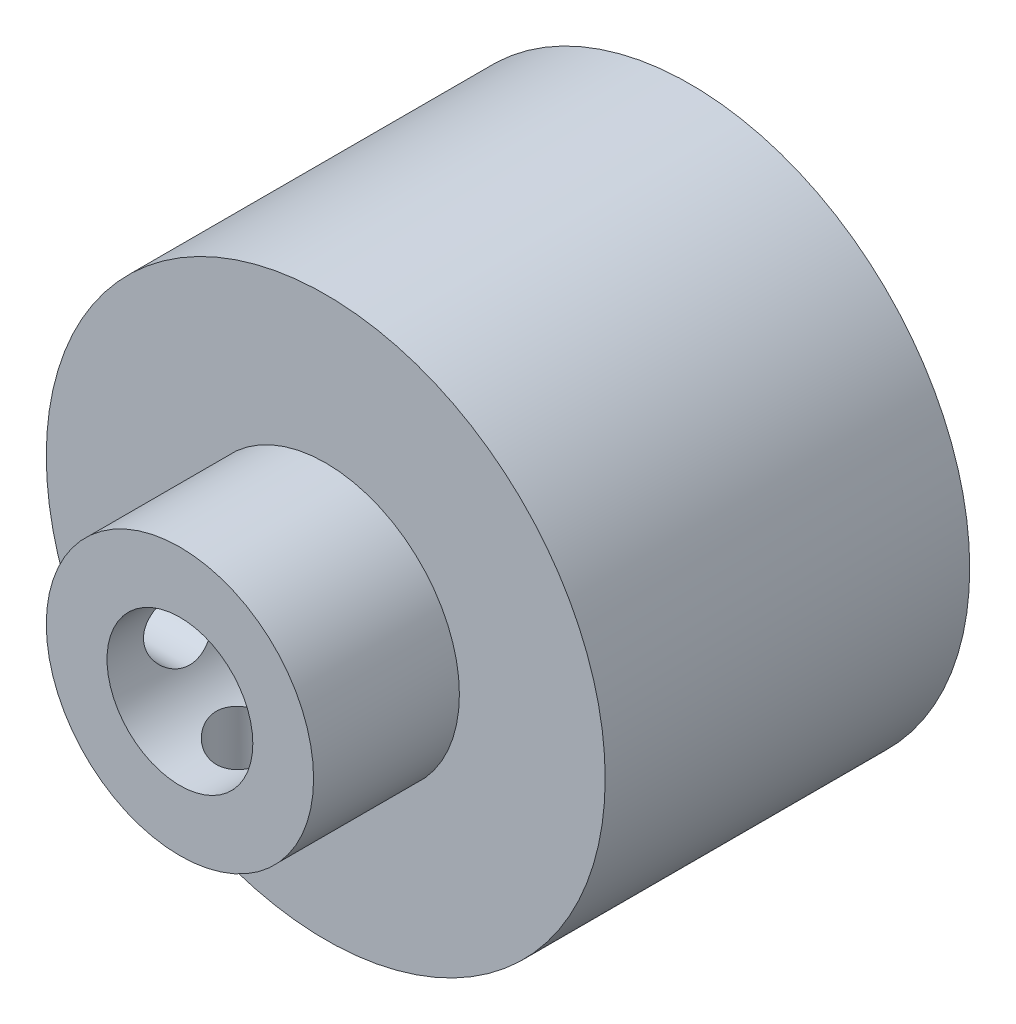
ISO-10303-21;
HEADER;
FILE_DESCRIPTION(('STEP AP214'),'2;1');
FILE_NAME('part.step','',(''),(''),'','','');
FILE_SCHEMA(('AUTOMOTIVE_DESIGN { 1 0 10303 214 1 1 1 1 }'));
ENDSEC;
DATA;
#1=APPLICATION_CONTEXT('core data for automotive mechanical design processes');
#2=APPLICATION_PROTOCOL_DEFINITION('international standard','automotive_design',2000,#1);
#3=PRODUCT_CONTEXT('',#1,'mechanical');
#4=PRODUCT('Part','Part','',(#3));
#5=PRODUCT_RELATED_PRODUCT_CATEGORY('part','',(#4));
#6=PRODUCT_DEFINITION_FORMATION('','',#4);
#7=PRODUCT_DEFINITION_CONTEXT('part definition',#1,'design');
#8=PRODUCT_DEFINITION('design','',#6,#7);
#9=PRODUCT_DEFINITION_SHAPE('','',#8);
#10=(LENGTH_UNIT() NAMED_UNIT(*) SI_UNIT(.MILLI.,.METRE.));
#11=(NAMED_UNIT(*) PLANE_ANGLE_UNIT() SI_UNIT($,.RADIAN.));
#12=(NAMED_UNIT(*) SI_UNIT($,.STERADIAN.) SOLID_ANGLE_UNIT());
#13=UNCERTAINTY_MEASURE_WITH_UNIT(LENGTH_MEASURE(1.E-05),#10,'distance_accuracy_value','');
#14=(GEOMETRIC_REPRESENTATION_CONTEXT(3) GLOBAL_UNCERTAINTY_ASSIGNED_CONTEXT((#13)) GLOBAL_UNIT_ASSIGNED_CONTEXT((#10,
#11,#12)) REPRESENTATION_CONTEXT('',''));
#15=CARTESIAN_POINT('',(0.,0.,0.));
#16=DIRECTION('',(0.,0.,1.));
#17=DIRECTION('',(1.,0.,0.));
#18=AXIS2_PLACEMENT_3D('',#15,#16,#17);
#19=CARTESIAN_POINT('',(0.,0.,15.));
#20=DIRECTION('',(0.,0.,-1.));
#21=DIRECTION('',(-1.,0.,0.));
#22=AXIS2_PLACEMENT_3D('',#19,#20,#21);
#23=CYLINDRICAL_SURFACE('',#22,11.5);
#24=CARTESIAN_POINT('',(0.,0.,15.));
#25=DIRECTION('',(0.,0.,1.));
#26=DIRECTION('',(1.,0.,0.));
#27=AXIS2_PLACEMENT_3D('',#24,#25,#26);
#28=CIRCLE('',#27,11.5);
#29=CARTESIAN_POINT('',(11.5,0.,15.));
#30=VERTEX_POINT('',#29);
#31=EDGE_CURVE('E63',#30,#30,#28,.T.);
#32=ORIENTED_EDGE('',*,*,#31,.F.);
#33=EDGE_LOOP('',(#32));
#34=FACE_BOUND('',#33,.T.);
#35=CARTESIAN_POINT('',(0.,0.,0.));
#36=DIRECTION('',(0.,0.,1.));
#37=DIRECTION('',(1.,0.,0.));
#38=AXIS2_PLACEMENT_3D('',#35,#36,#37);
#39=CIRCLE('',#38,11.5);
#40=CARTESIAN_POINT('',(11.5,0.,0.));
#41=VERTEX_POINT('',#40);
#42=EDGE_CURVE('E70',#41,#41,#39,.T.);
#43=ORIENTED_EDGE('',*,*,#42,.T.);
#44=EDGE_LOOP('',(#43));
#45=FACE_BOUND('',#44,.T.);
#46=ADVANCED_FACE('F50',(#34,#45),#23,.T.);
#47=CARTESIAN_POINT('',(0.,0.,15.));
#48=DIRECTION('',(0.,0.,1.));
#49=DIRECTION('',(1.,0.,0.));
#50=AXIS2_PLACEMENT_3D('',#47,#48,#49);
#51=PLANE('',#50);
#52=CARTESIAN_POINT('',(0.,0.,15.));
#53=DIRECTION('',(0.,0.,1.));
#54=DIRECTION('',(1.,0.,0.));
#55=AXIS2_PLACEMENT_3D('',#52,#53,#54);
#56=CIRCLE('',#55,5.5);
#57=CARTESIAN_POINT('',(5.5,0.,15.));
#58=VERTEX_POINT('',#57);
#59=EDGE_CURVE('E12',#58,#58,#56,.T.);
#60=ORIENTED_EDGE('',*,*,#59,.F.);
#61=EDGE_LOOP('',(#60));
#62=FACE_BOUND('',#61,.T.);
#63=ORIENTED_EDGE('',*,*,#31,.T.);
#64=EDGE_LOOP('',(#63));
#65=FACE_BOUND('',#64,.T.);
#66=ADVANCED_FACE('F118',(#62,#65),#51,.T.);
#67=CARTESIAN_POINT('',(0.,0.,0.));
#68=DIRECTION('',(0.,0.,1.));
#69=DIRECTION('',(1.,0.,0.));
#70=AXIS2_PLACEMENT_3D('',#67,#68,#69);
#71=PLANE('',#70);
#72=CARTESIAN_POINT('',(0.,0.,0.));
#73=DIRECTION('',(0.,0.,1.));
#74=DIRECTION('',(1.,0.,0.));
#75=AXIS2_PLACEMENT_3D('',#72,#73,#74);
#76=CIRCLE('',#75,3.);
#77=CARTESIAN_POINT('',(3.,0.,0.));
#78=VERTEX_POINT('',#77);
#79=EDGE_CURVE('E110',#78,#78,#76,.T.);
#80=ORIENTED_EDGE('',*,*,#79,.T.);
#81=EDGE_LOOP('',(#80));
#82=FACE_BOUND('',#81,.T.);
#83=ORIENTED_EDGE('',*,*,#42,.F.);
#84=EDGE_LOOP('',(#83));
#85=FACE_BOUND('',#84,.T.);
#86=ADVANCED_FACE('F116',(#82,#85),#71,.F.);
#87=CARTESIAN_POINT('',(0.,0.,21.));
#88=DIRECTION('',(0.,0.,-1.));
#89=DIRECTION('',(-1.,0.,0.));
#90=AXIS2_PLACEMENT_3D('',#87,#88,#89);
#91=CYLINDRICAL_SURFACE('',#90,5.5);
#92=CARTESIAN_POINT('',(-5.5,0.,19.5));
#93=CARTESIAN_POINT('',(-5.49999882717412,-0.0826209133321934,19.499998187389));
#94=CARTESIAN_POINT('',(-5.49812007260761,-0.165260978812708,19.4931509364166));
#95=CARTESIAN_POINT('',(-5.49080798085451,-0.328155930157697,19.4659941696968));
#96=CARTESIAN_POINT('',(-5.48537304740499,-0.408409727977264,19.4456786083714));
#97=CARTESIAN_POINT('',(-5.47154772174135,-0.564157626055395,19.3922982682616));
#98=CARTESIAN_POINT('',(-5.46316123869395,-0.639657866970164,19.3592503473381));
#99=CARTESIAN_POINT('',(-5.44431654412848,-0.78404449615972,19.2814070673376));
#100=CARTESIAN_POINT('',(-5.43385816956517,-0.852930363289777,19.2366107836461));
#101=CARTESIAN_POINT('',(-5.41171397042059,-0.98379694757326,19.1354001635327));
#102=CARTESIAN_POINT('',(-5.4000064149043,-1.04559512916994,19.0787545591458));
#103=CARTESIAN_POINT('',(-5.37682112935063,-1.15894293682478,18.9559473639701));
#104=CARTESIAN_POINT('',(-5.36534343055203,-1.21049117824721,18.8897844895977));
#105=CARTESIAN_POINT('',(-5.34369384163659,-1.30277794539497,18.7483487524205));
#106=CARTESIAN_POINT('',(-5.33354930058623,-1.34330426837586,18.6729328550637));
#107=CARTESIAN_POINT('',(-5.31603507411917,-1.41102916361228,18.5160361718006));
#108=CARTESIAN_POINT('',(-5.30866485085754,-1.43823031946844,18.4345565651115));
#109=CARTESIAN_POINT('',(-5.2977584719274,-1.47789456441268,18.2698721049875));
#110=CARTESIAN_POINT('',(-5.29413612283787,-1.49068960543229,18.1867530518381));
#111=CARTESIAN_POINT('',(-5.29087829084083,-1.50221364409134,18.0194753169912));
#112=CARTESIAN_POINT('',(-5.2912420257326,-1.50094540140882,17.9353168425));
#113=CARTESIAN_POINT('',(-5.29583824875456,-1.48464191780301,17.7709584490337));
#114=CARTESIAN_POINT('',(-5.29995718313671,-1.47001073668932,17.6907147653978));
#115=CARTESIAN_POINT('',(-5.31141755794059,-1.42804483871807,17.5338667139772));
#116=CARTESIAN_POINT('',(-5.31875926644153,-1.40070906504647,17.4572626495337));
#117=CARTESIAN_POINT('',(-5.33593618292326,-1.3337862982647,17.3088264794525));
#118=CARTESIAN_POINT('',(-5.34579959764141,-1.29405951882948,17.2370607989664));
#119=CARTESIAN_POINT('',(-5.36689368797792,-1.20357988022174,17.1010735525903));
#120=CARTESIAN_POINT('',(-5.37812464363249,-1.15282476106209,17.0368535371613));
#121=CARTESIAN_POINT('',(-5.40115894990605,-1.03967346682896,16.9154748101936));
#122=CARTESIAN_POINT('',(-5.41296874297114,-0.976938646167253,16.8586325507111));
#123=CARTESIAN_POINT('',(-5.43548647707979,-0.842682011788637,16.7562090350222));
#124=CARTESIAN_POINT('',(-5.44619437064292,-0.771159819718554,16.7106282639504));
#125=CARTESIAN_POINT('',(-5.46537278121261,-0.620853953739623,16.6318733272251));
#126=CARTESIAN_POINT('',(-5.47383251287305,-0.542037637417773,16.5987586614161));
#127=CARTESIAN_POINT('',(-5.48748356142612,-0.379672688714391,16.5463420274859));
#128=CARTESIAN_POINT('',(-5.49267562644564,-0.296125144317683,16.5270368975559));
#129=CARTESIAN_POINT('',(-5.49909228776313,-0.129368170483252,16.503289382203));
#130=CARTESIAN_POINT('',(-5.50043163125371,-0.0462242977839809,16.4984170046796));
#131=CARTESIAN_POINT('',(-5.49932301585136,0.119693365637972,16.5024827475134));
#132=CARTESIAN_POINT('',(-5.49687546782998,0.202467195532507,16.5114193696165));
#133=CARTESIAN_POINT('',(-5.48854239265957,0.363745097739556,16.5424975027031));
#134=CARTESIAN_POINT('',(-5.48271986472129,0.442299324272676,16.564397192757));
#135=CARTESIAN_POINT('',(-5.46829923535645,0.594609867448631,16.6204972446405));
#136=CARTESIAN_POINT('',(-5.45970082634473,0.668365651304997,16.6546989696613));
#137=CARTESIAN_POINT('',(-5.44041573828275,0.810641161194591,16.7352164422857));
#138=CARTESIAN_POINT('',(-5.4296902954988,0.879024602412584,16.7817634872616));
#139=CARTESIAN_POINT('',(-5.40738988410034,1.00716022013082,16.8853612875452));
#140=CARTESIAN_POINT('',(-5.39581474001048,1.06691060617763,16.9424142161575));
#141=CARTESIAN_POINT('',(-5.37269401558495,1.17791060344313,17.0674140380349));
#142=CARTESIAN_POINT('',(-5.36115944983886,1.22885627747222,17.135633382279));
#143=CARTESIAN_POINT('',(-5.33980026187814,1.3185858220796,17.2798986472192));
#144=CARTESIAN_POINT('',(-5.32997557125461,1.35737017925923,17.3559442546075));
#145=CARTESIAN_POINT('',(-5.31326248703816,1.4213855831721,17.513340628242));
#146=CARTESIAN_POINT('',(-5.30635748202252,1.44669352306986,17.5946582605252));
#147=CARTESIAN_POINT('',(-5.29626814696188,1.48320917220692,17.7606168380276));
#148=CARTESIAN_POINT('',(-5.29308281231875,1.49442068863148,17.8452568795537));
#149=CARTESIAN_POINT('',(-5.29088009671763,1.50219895576908,18.0123384038174));
#150=CARTESIAN_POINT('',(-5.29172336001588,1.49925533217026,18.0947555887225));
#151=CARTESIAN_POINT('',(-5.29715501736986,1.47994837643976,18.257870647735));
#152=CARTESIAN_POINT('',(-5.30174330649891,1.46358542028567,18.338568569947));
#153=CARTESIAN_POINT('',(-5.31406316491799,1.41819408435119,18.4953063157761));
#154=CARTESIAN_POINT('',(-5.32176783125817,1.38927395449127,18.5713797532418));
#155=CARTESIAN_POINT('',(-5.33945189987963,1.31967304541386,18.7176532768133));
#156=CARTESIAN_POINT('',(-5.34943167369227,1.27899034504456,18.7878524010652));
#157=CARTESIAN_POINT('',(-5.37092379381814,1.18555430984852,18.9227105976926));
#158=CARTESIAN_POINT('',(-5.38247375845259,1.13246901822125,18.9871337048431));
#159=CARTESIAN_POINT('',(-5.40559990490855,1.01636011199274,19.1063164067946));
#160=CARTESIAN_POINT('',(-5.41717609247304,0.953334059387993,19.1610736240053));
#161=CARTESIAN_POINT('',(-5.43936459177359,0.817407725686078,19.2605946145194));
#162=CARTESIAN_POINT('',(-5.44994907753807,0.744315866262519,19.305103480867));
#163=CARTESIAN_POINT('',(-5.46865263780403,0.591399899839279,19.3811324362115));
#164=CARTESIAN_POINT('',(-5.47677322151197,0.511579952421221,19.4126604805543));
#165=CARTESIAN_POINT('',(-5.48864193995757,0.360100101218211,19.457939509979));
#166=CARTESIAN_POINT('',(-5.49286947681091,0.289064640262469,19.4736745512417));
#167=CARTESIAN_POINT('',(-5.49854887164354,0.145357607941485,19.4947050253188));
#168=CARTESIAN_POINT('',(-5.5000010318002,0.0726862155649472,19.5000015946548));
#169=CARTESIAN_POINT('',(-5.5,0.,19.5));
#170=B_SPLINE_CURVE_WITH_KNOTS('',3,(#92,#93,#94,#95,#96,#97,#98,#99,#100,#101,#102,#103,#104,
#105,#106,#107,#108,#109,#110,#111,#112,#113,#114,#115,#116,#117,#118,#119,#120,#121,#122,#123,
#124,#125,#126,#127,#128,#129,#130,#131,#132,#133,#134,#135,#136,#137,#138,#139,#140,#141,#142,
#143,#144,#145,#146,#147,#148,#149,#150,#151,#152,#153,#154,#155,#156,#157,#158,#159,#160,#161,
#162,#163,#164,#165,#166,#167,#168,#169),.UNSPECIFIED.,.T.,.F.,(4,2,2,2,2,2,2,2,2,2,2,2,2,2,2,2,
2,2,2,2,2,2,2,2,2,2,2,2,2,2,2,2,2,2,2,2,2,2,4),(0.,0.247596106854896,0.4953034285513,
0.742683902420581,0.990083851364705,1.24285878223178,1.49566783659324,1.75304593650219,
2.01037411390996,2.26164304860926,2.51286267696538,2.75672886674887,3.00061534583717,
3.24735926767928,3.49415380139121,3.74938528550775,4.00462776284424,4.26107349736028,
4.51746049766944,4.76612811343083,5.01476875105251,5.25891111200195,5.50308053475837,
5.75219469009682,6.00136043656003,6.2579007306487,6.51443075867912,6.76948096455405,
7.02446227124211,7.27068852228629,7.51690787489588,7.76104555655817,8.00522313517587,
8.25689011392092,8.50861891104975,8.76605872289059,9.02334052607437,9.2411883209319,
9.45901239561305),.UNSPECIFIED.);
#171=CARTESIAN_POINT('',(-5.5,0.,19.5));
#172=VERTEX_POINT('',#171);
#173=EDGE_CURVE('E86',#172,#172,#170,.T.);
#174=ORIENTED_EDGE('',*,*,#173,.T.);
#175=EDGE_LOOP('',(#174));
#176=FACE_BOUND('',#175,.T.);
#177=CARTESIAN_POINT('',(0.,-5.5,19.5));
#178=CARTESIAN_POINT('',(0.0826209133321934,-5.49999882717412,19.499998187389));
#179=CARTESIAN_POINT('',(0.165260978812708,-5.49812007260761,19.4931509364166));
#180=CARTESIAN_POINT('',(0.328155930157697,-5.49080798085451,19.4659941696968));
#181=CARTESIAN_POINT('',(0.408409727977264,-5.48537304740499,19.4456786083714));
#182=CARTESIAN_POINT('',(0.564157626055395,-5.47154772174135,19.3922982682616));
#183=CARTESIAN_POINT('',(0.639657866970164,-5.46316123869395,19.3592503473381));
#184=CARTESIAN_POINT('',(0.784044496159721,-5.44431654412848,19.2814070673376));
#185=CARTESIAN_POINT('',(0.852930363289778,-5.43385816956517,19.2366107836461));
#186=CARTESIAN_POINT('',(0.98379694757326,-5.41171397042059,19.1354001635327));
#187=CARTESIAN_POINT('',(1.04559512916994,-5.4000064149043,19.0787545591458));
#188=CARTESIAN_POINT('',(1.15894293682478,-5.37682112935063,18.9559473639701));
#189=CARTESIAN_POINT('',(1.21049117824721,-5.36534343055203,18.8897844895977));
#190=CARTESIAN_POINT('',(1.30277794539497,-5.34369384163659,18.7483487524205));
#191=CARTESIAN_POINT('',(1.34330426837586,-5.33354930058623,18.6729328550637));
#192=CARTESIAN_POINT('',(1.41102916361228,-5.31603507411917,18.5160361718006));
#193=CARTESIAN_POINT('',(1.43823031946844,-5.30866485085754,18.4345565651115));
#194=CARTESIAN_POINT('',(1.47789456441268,-5.2977584719274,18.2698721049875));
#195=CARTESIAN_POINT('',(1.49068960543229,-5.29413612283787,18.1867530518381));
#196=CARTESIAN_POINT('',(1.50221364409134,-5.29087829084083,18.0194753169912));
#197=CARTESIAN_POINT('',(1.50094540140882,-5.2912420257326,17.9353168425));
#198=CARTESIAN_POINT('',(1.48464191780301,-5.29583824875456,17.7709584490337));
#199=CARTESIAN_POINT('',(1.47001073668932,-5.29995718313671,17.6907147653978));
#200=CARTESIAN_POINT('',(1.42804483871807,-5.31141755794059,17.5338667139772));
#201=CARTESIAN_POINT('',(1.40070906504647,-5.31875926644153,17.4572626495337));
#202=CARTESIAN_POINT('',(1.3337862982647,-5.33593618292326,17.3088264794525));
#203=CARTESIAN_POINT('',(1.29405951882948,-5.34579959764141,17.2370607989664));
#204=CARTESIAN_POINT('',(1.20357988022174,-5.36689368797792,17.1010735525903));
#205=CARTESIAN_POINT('',(1.15282476106209,-5.37812464363249,17.0368535371613));
#206=CARTESIAN_POINT('',(1.03967346682896,-5.40115894990605,16.9154748101936));
#207=CARTESIAN_POINT('',(0.976938646167254,-5.41296874297114,16.8586325507111));
#208=CARTESIAN_POINT('',(0.842682011788637,-5.43548647707979,16.7562090350222));
#209=CARTESIAN_POINT('',(0.771159819718554,-5.44619437064292,16.7106282639504));
#210=CARTESIAN_POINT('',(0.620853953739623,-5.46537278121261,16.6318733272251));
#211=CARTESIAN_POINT('',(0.542037637417774,-5.47383251287305,16.5987586614161));
#212=CARTESIAN_POINT('',(0.379672688714392,-5.48748356142612,16.5463420274859));
#213=CARTESIAN_POINT('',(0.296125144317683,-5.49267562644564,16.5270368975559));
#214=CARTESIAN_POINT('',(0.129368170483252,-5.49909228776313,16.503289382203));
#215=CARTESIAN_POINT('',(0.0462242977839806,-5.50043163125371,16.4984170046796));
#216=CARTESIAN_POINT('',(-0.119693365637972,-5.49932301585136,16.5024827475134));
#217=CARTESIAN_POINT('',(-0.202467195532507,-5.49687546782998,16.5114193696165));
#218=CARTESIAN_POINT('',(-0.363745097739557,-5.48854239265957,16.5424975027031));
#219=CARTESIAN_POINT('',(-0.442299324272678,-5.48271986472129,16.564397192757));
#220=CARTESIAN_POINT('',(-0.594609867448633,-5.46829923535645,16.6204972446405));
#221=CARTESIAN_POINT('',(-0.668365651304998,-5.45970082634473,16.6546989696613));
#222=CARTESIAN_POINT('',(-0.810641161194592,-5.44041573828275,16.7352164422857));
#223=CARTESIAN_POINT('',(-0.879024602412584,-5.4296902954988,16.7817634872616));
#224=CARTESIAN_POINT('',(-1.00716022013082,-5.40738988410034,16.8853612875452));
#225=CARTESIAN_POINT('',(-1.06691060617763,-5.39581474001048,16.9424142161575));
#226=CARTESIAN_POINT('',(-1.17791060344313,-5.37269401558495,17.0674140380349));
#227=CARTESIAN_POINT('',(-1.22885627747222,-5.36115944983885,17.135633382279));
#228=CARTESIAN_POINT('',(-1.3185858220796,-5.33980026187814,17.2798986472192));
#229=CARTESIAN_POINT('',(-1.35737017925924,-5.32997557125461,17.3559442546075));
#230=CARTESIAN_POINT('',(-1.4213855831721,-5.31326248703816,17.513340628242));
#231=CARTESIAN_POINT('',(-1.44669352306986,-5.30635748202252,17.5946582605252));
#232=CARTESIAN_POINT('',(-1.48320917220692,-5.29626814696188,17.7606168380276));
#233=CARTESIAN_POINT('',(-1.49442068863148,-5.29308281231875,17.8452568795537));
#234=CARTESIAN_POINT('',(-1.50219895576908,-5.29088009671763,18.0123384038174));
#235=CARTESIAN_POINT('',(-1.49925533217026,-5.29172336001588,18.0947555887225));
#236=CARTESIAN_POINT('',(-1.47994837643976,-5.29715501736986,18.257870647735));
#237=CARTESIAN_POINT('',(-1.46358542028567,-5.30174330649891,18.338568569947));
#238=CARTESIAN_POINT('',(-1.41819408435119,-5.31406316491799,18.4953063157761));
#239=CARTESIAN_POINT('',(-1.38927395449127,-5.32176783125817,18.5713797532418));
#240=CARTESIAN_POINT('',(-1.31967304541386,-5.33945189987963,18.7176532768133));
#241=CARTESIAN_POINT('',(-1.27899034504456,-5.34943167369227,18.7878524010652));
#242=CARTESIAN_POINT('',(-1.18555430984852,-5.37092379381814,18.9227105976926));
#243=CARTESIAN_POINT('',(-1.13246901822125,-5.38247375845259,18.9871337048431));
#244=CARTESIAN_POINT('',(-1.01636011199274,-5.40559990490855,19.1063164067946));
#245=CARTESIAN_POINT('',(-0.953334059387994,-5.41717609247304,19.1610736240053));
#246=CARTESIAN_POINT('',(-0.817407725686079,-5.43936459177359,19.2605946145194));
#247=CARTESIAN_POINT('',(-0.74431586626252,-5.44994907753807,19.305103480867));
#248=CARTESIAN_POINT('',(-0.59139989983928,-5.46865263780403,19.3811324362115));
#249=CARTESIAN_POINT('',(-0.511579952421221,-5.47677322151197,19.4126604805543));
#250=CARTESIAN_POINT('',(-0.360100101218211,-5.48864193995757,19.457939509979));
#251=CARTESIAN_POINT('',(-0.289064640262468,-5.49286947681091,19.4736745512417));
#252=CARTESIAN_POINT('',(-0.145357607941484,-5.49854887164354,19.4947050253188));
#253=CARTESIAN_POINT('',(-0.0726862155649467,-5.5000010318002,19.5000015946548));
#254=CARTESIAN_POINT('',(0.,-5.5,19.5));
#255=B_SPLINE_CURVE_WITH_KNOTS('',3,(#177,#178,#179,#180,#181,#182,#183,#184,#185,#186,#187,
#188,#189,#190,#191,#192,#193,#194,#195,#196,#197,#198,#199,#200,#201,#202,#203,#204,#205,#206,
#207,#208,#209,#210,#211,#212,#213,#214,#215,#216,#217,#218,#219,#220,#221,#222,#223,#224,#225,
#226,#227,#228,#229,#230,#231,#232,#233,#234,#235,#236,#237,#238,#239,#240,#241,#242,#243,#244,
#245,#246,#247,#248,#249,#250,#251,#252,#253,#254),.UNSPECIFIED.,.T.,.F.,(4,2,2,2,2,2,2,2,2,2,2,
2,2,2,2,2,2,2,2,2,2,2,2,2,2,2,2,2,2,2,2,2,2,2,2,2,2,2,4),(0.,0.247596106854896,0.4953034285513,
0.742683902420581,0.990083851364705,1.24285878223178,1.49566783659324,1.7530459365022,
2.01037411390997,2.26164304860926,2.51286267696538,2.75672886674887,3.00061534583717,
3.24735926767928,3.49415380139121,3.74938528550775,4.00462776284424,4.26107349736028,
4.51746049766944,4.76612811343083,5.01476875105251,5.25891111200196,5.50308053475837,
5.75219469009682,6.00136043656003,6.2579007306487,6.51443075867912,6.76948096455405,
7.02446227124211,7.27068852228629,7.51690787489588,7.76104555655817,8.00522313517587,
8.25689011392092,8.50861891104975,8.76605872289059,9.02334052607437,9.2411883209319,
9.45901239561305),.UNSPECIFIED.);
#256=CARTESIAN_POINT('',(0.,-5.5,19.5));
#257=VERTEX_POINT('',#256);
#258=EDGE_CURVE('E85',#257,#257,#255,.T.);
#259=ORIENTED_EDGE('',*,*,#258,.T.);
#260=EDGE_LOOP('',(#259));
#261=FACE_BOUND('',#260,.T.);
#262=CARTESIAN_POINT('',(0.,0.,21.));
#263=DIRECTION('',(0.,0.,1.));
#264=DIRECTION('',(1.,0.,0.));
#265=AXIS2_PLACEMENT_3D('',#262,#263,#264);
#266=CIRCLE('',#265,5.5);
#267=CARTESIAN_POINT('',(5.5,0.,21.));
#268=VERTEX_POINT('',#267);
#269=EDGE_CURVE('E73',#268,#268,#266,.T.);
#270=ORIENTED_EDGE('',*,*,#269,.F.);
#271=EDGE_LOOP('',(#270));
#272=FACE_BOUND('',#271,.T.);
#273=ORIENTED_EDGE('',*,*,#59,.T.);
#274=EDGE_LOOP('',(#273));
#275=FACE_BOUND('',#274,.T.);
#276=ADVANCED_FACE('F111',(#176,#261,#272,#275),#91,.T.);
#277=CARTESIAN_POINT('',(0.,0.,21.));
#278=DIRECTION('',(0.,0.,1.));
#279=DIRECTION('',(1.,0.,0.));
#280=AXIS2_PLACEMENT_3D('',#277,#278,#279);
#281=PLANE('',#280);
#282=CARTESIAN_POINT('',(0.,0.,21.));
#283=DIRECTION('',(0.,0.,1.));
#284=DIRECTION('',(1.,0.,0.));
#285=AXIS2_PLACEMENT_3D('',#282,#283,#284);
#286=CIRCLE('',#285,3.);
#287=CARTESIAN_POINT('',(3.,0.,21.));
#288=VERTEX_POINT('',#287);
#289=EDGE_CURVE('E106',#288,#288,#286,.T.);
#290=ORIENTED_EDGE('',*,*,#289,.F.);
#291=EDGE_LOOP('',(#290));
#292=FACE_BOUND('',#291,.T.);
#293=ORIENTED_EDGE('',*,*,#269,.T.);
#294=EDGE_LOOP('',(#293));
#295=FACE_BOUND('',#294,.T.);
#296=ADVANCED_FACE('F115',(#292,#295),#281,.T.);
#297=CARTESIAN_POINT('',(0.,0.,0.));
#298=DIRECTION('',(0.,0.,1.));
#299=DIRECTION('',(1.,0.,0.));
#300=AXIS2_PLACEMENT_3D('',#297,#298,#299);
#301=CYLINDRICAL_SURFACE('',#300,3.);
#302=CARTESIAN_POINT('',(-3.,0.,16.5));
#303=CARTESIAN_POINT('',(-2.99999570107562,-0.0788579444268501,16.5000049534758));
#304=CARTESIAN_POINT('',(-2.99685736529635,-0.157809899546344,16.5062551096816));
#305=CARTESIAN_POINT('',(-2.98461234055736,-0.313380352903344,16.5309793205123));
#306=CARTESIAN_POINT('',(-2.97549431743379,-0.389994130070444,16.5494765894967));
#307=CARTESIAN_POINT('',(-2.95224419105063,-0.538400317320673,16.5977907129249));
#308=CARTESIAN_POINT('',(-2.93813158766306,-0.610210204408719,16.627563576372));
#309=CARTESIAN_POINT('',(-2.90618664773642,-0.747708925209897,16.6973559320475));
#310=CARTESIAN_POINT('',(-2.88835460450288,-0.813398240985088,16.7373746163733));
#311=CARTESIAN_POINT('',(-2.84934387387093,-0.941261726642863,16.8292758742279));
#312=CARTESIAN_POINT('',(-2.82802798691306,-1.00298281668316,16.8817297188595));
#313=CARTESIAN_POINT('',(-2.78489955370115,-1.11716916730047,16.9957822188706));
#314=CARTESIAN_POINT('',(-2.76308664313552,-1.16962737466015,17.0573877776587));
#315=CARTESIAN_POINT('',(-2.71948426796021,-1.26787800067542,17.1937250242851));
#316=CARTESIAN_POINT('',(-2.69782780455198,-1.31283800332745,17.2691041475189));
#317=CARTESIAN_POINT('',(-2.65928968158481,-1.38925234033604,17.4275510039793));
#318=CARTESIAN_POINT('',(-2.64240461410484,-1.4207163224495,17.5106131930841));
#319=CARTESIAN_POINT('',(-2.61686800556713,-1.46719866328288,17.6769976581329));
#320=CARTESIAN_POINT('',(-2.6077840737557,-1.48308878562066,17.7600066781011));
#321=CARTESIAN_POINT('',(-2.59772834922792,-1.50064048996327,17.9279682566692));
#322=CARTESIAN_POINT('',(-2.59674854014932,-1.50231613255961,18.0129188113067));
#323=CARTESIAN_POINT('',(-2.60266395385873,-1.49203093075844,18.1714290364731));
#324=CARTESIAN_POINT('',(-2.6086314549302,-1.48167683930523,18.2451360468346));
#325=CARTESIAN_POINT('',(-2.62614343100775,-1.4504097735854,18.3895828640596));
#326=CARTESIAN_POINT('',(-2.63768968247664,-1.42949343584648,18.460321717958));
#327=CARTESIAN_POINT('',(-2.66531214619112,-1.37731467057901,18.5988436988485));
#328=CARTESIAN_POINT('',(-2.68148760995998,-1.34582260067399,18.6665195981787));
#329=CARTESIAN_POINT('',(-2.71655106422106,-1.27356253150201,18.795951438885));
#330=CARTESIAN_POINT('',(-2.73544027170286,-1.2327903657187,18.8577047034001));
#331=CARTESIAN_POINT('',(-2.77669736854929,-1.13709908236918,18.9817818791148));
#332=CARTESIAN_POINT('',(-2.79920265355119,-1.08104168755392,19.0431853103642));
#333=CARTESIAN_POINT('',(-2.84321434950611,-0.959333368112062,19.1561031278864));
#334=CARTESIAN_POINT('',(-2.86472027938201,-0.893677884861431,19.2076127880508));
#335=CARTESIAN_POINT('',(-2.90552980924446,-0.750774758747775,19.3015284915446));
#336=CARTESIAN_POINT('',(-2.92468476243011,-0.673130387399114,19.3434007086686));
#337=CARTESIAN_POINT('',(-2.95736821681863,-0.510699323233196,19.4131455435645));
#338=CARTESIAN_POINT('',(-2.9709011841533,-0.425918364397915,19.4410292775227));
#339=CARTESIAN_POINT('',(-2.98986500612153,-0.259149737491055,19.479713105575));
#340=CARTESIAN_POINT('',(-2.99587407451965,-0.17751229582249,19.4917368536202));
#341=CARTESIAN_POINT('',(-3.00109520188655,-0.0131693999240284,19.5021970967017));
#342=CARTESIAN_POINT('',(-3.00031048081978,0.0695355298048622,19.5006400284592));
#343=CARTESIAN_POINT('',(-2.99236788380152,0.226849457978979,19.4846899673719));
#344=CARTESIAN_POINT('',(-2.98570868532253,0.301589112074894,19.471301200905));
#345=CARTESIAN_POINT('',(-2.9673325697226,0.44761033845291,19.4336428921573));
#346=CARTESIAN_POINT('',(-2.95561509501618,0.51889152853663,19.4093721503198));
#347=CARTESIAN_POINT('',(-2.92776377120382,0.658332912674358,19.3500023003505));
#348=CARTESIAN_POINT('',(-2.91151322654446,0.726345595508703,19.3146134248256));
#349=CARTESIAN_POINT('',(-2.87615961476127,0.855692042548905,19.2343386965301));
#350=CARTESIAN_POINT('',(-2.85705533350407,0.917022944664886,19.1894487981069));
#351=CARTESIAN_POINT('',(-2.81562332004297,1.03765153393382,19.0863593620039));
#352=CARTESIAN_POINT('',(-2.79316327265249,1.09615811672854,19.0272856973323));
#353=CARTESIAN_POINT('',(-2.7489358741323,1.20278448167828,18.9001122730834));
#354=CARTESIAN_POINT('',(-2.72716901100071,1.25089707856781,18.8320063217281));
#355=CARTESIAN_POINT('',(-2.68576788309734,1.33756187171853,18.6845345187405));
#356=CARTESIAN_POINT('',(-2.66628794383591,1.37553824370037,18.6047831008583));
#357=CARTESIAN_POINT('',(-2.63361108441202,1.43712423890206,18.4387348986376));
#358=CARTESIAN_POINT('',(-2.62040607332625,1.46075237380053,18.3524467102997));
#359=CARTESIAN_POINT('',(-2.60342251538703,1.49079253120031,18.1846346656729));
#360=CARTESIAN_POINT('',(-2.59886075197597,1.49863949460818,18.1034486198471));
#361=CARTESIAN_POINT('',(-2.59748031962405,1.5010337315643,17.9408293992532));
#362=CARTESIAN_POINT('',(-2.60065829439585,1.49558676993486,17.8593963468932));
#363=CARTESIAN_POINT('',(-2.61356793076615,1.47288918838997,17.7067747476998));
#364=CARTESIAN_POINT('',(-2.62264641723988,1.45681247151455,17.6353492947829));
#365=CARTESIAN_POINT('',(-2.64556524281479,1.41476303733662,17.4962878208635));
#366=CARTESIAN_POINT('',(-2.65940711354503,1.38878713673988,17.428653026862));
#367=CARTESIAN_POINT('',(-2.69142795546803,1.32572361795085,17.2940627235202));
#368=CARTESIAN_POINT('',(-2.70983583593881,1.28800670672355,17.2274581472565));
#369=CARTESIAN_POINT('',(-2.74852997452291,1.20322645745609,17.1010881957281));
#370=CARTESIAN_POINT('',(-2.76881720693416,1.15615825686234,17.0413264042183));
#371=CARTESIAN_POINT('',(-2.81193484737138,1.04730498999206,16.922787026468));
#372=CARTESIAN_POINT('',(-2.83477474959942,0.984426634495894,16.8650113464746));
#373=CARTESIAN_POINT('',(-2.87816628389896,0.849232209349799,16.7606055248471));
#374=CARTESIAN_POINT('',(-2.89871667939293,0.776911084957799,16.7139813907951));
#375=CARTESIAN_POINT('',(-2.93547014349806,0.623897395174421,16.6331454559319));
#376=CARTESIAN_POINT('',(-2.95164144740899,0.543149255665098,16.5990237461453));
#377=CARTESIAN_POINT('',(-2.9775201194848,0.376113151707131,16.5452877483639));
#378=CARTESIAN_POINT('',(-2.98724585044602,0.289841699383651,16.5256322297914));
#379=CARTESIAN_POINT('',(-2.99543192870217,0.168902919736344,16.5091538833714));
#380=CARTESIAN_POINT('',(-2.99714048010376,0.135242819162348,16.5057260387005));
#381=CARTESIAN_POINT('',(-2.99942545465223,0.0677275977076379,16.5011480017289));
#382=CARTESIAN_POINT('',(-3.00000184655071,0.033872471469943,16.4999978722947));
#383=CARTESIAN_POINT('',(-3.,0.,16.5));
#384=B_SPLINE_CURVE_WITH_KNOTS('',3,(#302,#303,#304,#305,#306,#307,#308,#309,#310,#311,#312,
#313,#314,#315,#316,#317,#318,#319,#320,#321,#322,#323,#324,#325,#326,#327,#328,#329,#330,#331,
#332,#333,#334,#335,#336,#337,#338,#339,#340,#341,#342,#343,#344,#345,#346,#347,#348,#349,#350,
#351,#352,#353,#354,#355,#356,#357,#358,#359,#360,#361,#362,#363,#364,#365,#366,#367,#368,#369,
#370,#371,#372,#373,#374,#375,#376,#377,#378,#379,#380,#381,#382,#383),.UNSPECIFIED.,.T.,.F.,(4,
2,2,2,2,2,2,2,2,2,2,2,2,2,2,2,2,2,2,2,2,2,2,2,2,2,2,2,2,2,2,2,2,2,2,2,2,2,2,2,4),(0.,
0.236436386130438,0.473322224563797,0.709293233238447,0.945245640872351,1.19547263807713,
1.44588935648105,1.71572589646129,1.98536921847421,2.23887018210344,2.49212035993531,
2.71508568613981,2.93812205888518,3.16635360252731,3.39468781890332,3.65197412000818,
3.9093830189803,4.17874533321661,4.4478932536842,4.69474935707019,4.94148846767214,
5.16910359759183,5.39674382446397,5.63089284041848,5.86514176122509,6.12239415966629,
6.37982382923148,6.64972023242589,6.91926767918176,7.1629396125457,7.40650589797017,
7.62686895373284,7.84730293182527,8.08254685170431,8.31791341715446,8.58187864135757,
8.84598575071869,9.1119602049529,9.37717362931724,9.47872920200876,9.58028757766599),.UNSPECIFIED.);
#385=CARTESIAN_POINT('',(-3.,0.,16.5));
#386=VERTEX_POINT('',#385);
#387=EDGE_CURVE('E53',#386,#386,#384,.T.);
#388=ORIENTED_EDGE('',*,*,#387,.T.);
#389=EDGE_LOOP('',(#388));
#390=FACE_BOUND('',#389,.T.);
#391=CARTESIAN_POINT('',(0.,-3.,19.5));
#392=CARTESIAN_POINT('',(-0.07885794442685,-2.99999570107562,19.4999950465242));
#393=CARTESIAN_POINT('',(-0.157809899546343,-2.99685736529635,19.4937448903184));
#394=CARTESIAN_POINT('',(-0.313380352903344,-2.98461234055736,19.4690206794877));
#395=CARTESIAN_POINT('',(-0.389994130070444,-2.97549431743379,19.4505234105033));
#396=CARTESIAN_POINT('',(-0.538400317320673,-2.95224419105063,19.4022092870751));
#397=CARTESIAN_POINT('',(-0.610210204408719,-2.93813158766306,19.372436423628));
#398=CARTESIAN_POINT('',(-0.747708925209898,-2.90618664773642,19.3026440679525));
#399=CARTESIAN_POINT('',(-0.813398240985088,-2.88835460450288,19.2626253836267));
#400=CARTESIAN_POINT('',(-0.941261726642863,-2.84934387387093,19.1707241257721));
#401=CARTESIAN_POINT('',(-1.00298281668316,-2.82802798691306,19.1182702811405));
#402=CARTESIAN_POINT('',(-1.11716916730047,-2.78489955370115,19.0042177811294));
#403=CARTESIAN_POINT('',(-1.16962737466015,-2.76308664313552,18.9426122223413));
#404=CARTESIAN_POINT('',(-1.26787800067542,-2.71948426796021,18.8062749757149));
#405=CARTESIAN_POINT('',(-1.31283800332745,-2.69782780455198,18.7308958524811));
#406=CARTESIAN_POINT('',(-1.38925234033604,-2.65928968158481,18.5724489960207));
#407=CARTESIAN_POINT('',(-1.4207163224495,-2.64240461410484,18.4893868069159));
#408=CARTESIAN_POINT('',(-1.46719866328288,-2.61686800556713,18.3230023418671));
#409=CARTESIAN_POINT('',(-1.48308878562066,-2.6077840737557,18.2399933218989));
#410=CARTESIAN_POINT('',(-1.50064048996327,-2.59772834922792,18.0720317433308));
#411=CARTESIAN_POINT('',(-1.50231613255961,-2.59674854014932,17.9870811886933));
#412=CARTESIAN_POINT('',(-1.49203093075844,-2.60266395385873,17.8285709635269));
#413=CARTESIAN_POINT('',(-1.48167683930523,-2.6086314549302,17.7548639531654));
#414=CARTESIAN_POINT('',(-1.4504097735854,-2.62614343100775,17.6104171359404));
#415=CARTESIAN_POINT('',(-1.42949343584648,-2.63768968247664,17.539678282042));
#416=CARTESIAN_POINT('',(-1.37731467057901,-2.66531214619112,17.4011563011515));
#417=CARTESIAN_POINT('',(-1.34582260067399,-2.68148760995998,17.3334804018213));
#418=CARTESIAN_POINT('',(-1.27356253150201,-2.71655106422105,17.204048561115));
#419=CARTESIAN_POINT('',(-1.2327903657187,-2.73544027170286,17.1422952965999));
#420=CARTESIAN_POINT('',(-1.13709908236918,-2.77669736854929,17.0182181208852));
#421=CARTESIAN_POINT('',(-1.08104168755392,-2.79920265355119,16.9568146896358));
#422=CARTESIAN_POINT('',(-0.959333368112062,-2.84321434950611,16.8438968721136));
#423=CARTESIAN_POINT('',(-0.89367788486143,-2.86472027938201,16.7923872119492));
#424=CARTESIAN_POINT('',(-0.750774758747774,-2.90552980924446,16.6984715084554));
#425=CARTESIAN_POINT('',(-0.673130387399114,-2.92468476243011,16.6565992913314));
#426=CARTESIAN_POINT('',(-0.510699323233196,-2.95736821681863,16.5868544564355));
#427=CARTESIAN_POINT('',(-0.425918364397915,-2.9709011841533,16.5589707224772));
#428=CARTESIAN_POINT('',(-0.259149737491055,-2.98986500612153,16.520286894425));
#429=CARTESIAN_POINT('',(-0.17751229582249,-2.99587407451965,16.5082631463798));
#430=CARTESIAN_POINT('',(-0.0131693999240283,-3.00109520188655,16.4978029032983));
#431=CARTESIAN_POINT('',(0.0695355298048626,-3.00031048081978,16.4993599715408));
#432=CARTESIAN_POINT('',(0.22684945797898,-2.99236788380152,16.5153100326281));
#433=CARTESIAN_POINT('',(0.301589112074894,-2.98570868532253,16.528698799095));
#434=CARTESIAN_POINT('',(0.447610338452911,-2.9673325697226,16.5663571078427));
#435=CARTESIAN_POINT('',(0.51889152853663,-2.95561509501618,16.5906278496802));
#436=CARTESIAN_POINT('',(0.658332912674359,-2.92776377120382,16.6499976996495));
#437=CARTESIAN_POINT('',(0.726345595508704,-2.91151322654446,16.6853865751744));
#438=CARTESIAN_POINT('',(0.855692042548906,-2.87615961476126,16.7656613034699));
#439=CARTESIAN_POINT('',(0.917022944664886,-2.85705533350407,16.8105512018931));
#440=CARTESIAN_POINT('',(1.03765153393382,-2.81562332004297,16.9136406379961));
#441=CARTESIAN_POINT('',(1.09615811672854,-2.79316327265249,16.9727143026677));
#442=CARTESIAN_POINT('',(1.20278448167828,-2.7489358741323,17.0998877269166));
#443=CARTESIAN_POINT('',(1.25089707856781,-2.72716901100071,17.1679936782719));
#444=CARTESIAN_POINT('',(1.33756187171853,-2.68576788309734,17.3154654812595));
#445=CARTESIAN_POINT('',(1.37553824370037,-2.66628794383591,17.3952168991417));
#446=CARTESIAN_POINT('',(1.43712423890206,-2.63361108441202,17.5612651013624));
#447=CARTESIAN_POINT('',(1.46075237380053,-2.62040607332625,17.6475532897003));
#448=CARTESIAN_POINT('',(1.49079253120031,-2.60342251538703,17.8153653343271));
#449=CARTESIAN_POINT('',(1.49863949460818,-2.59886075197597,17.8965513801529));
#450=CARTESIAN_POINT('',(1.5010337315643,-2.59748031962405,18.0591706007468));
#451=CARTESIAN_POINT('',(1.49558676993486,-2.60065829439585,18.1406036531068));
#452=CARTESIAN_POINT('',(1.47288918838996,-2.61356793076615,18.2932252523002));
#453=CARTESIAN_POINT('',(1.45681247151455,-2.62264641723988,18.3646507052171));
#454=CARTESIAN_POINT('',(1.41476303733662,-2.64556524281479,18.5037121791366));
#455=CARTESIAN_POINT('',(1.38878713673988,-2.65940711354503,18.571346973138));
#456=CARTESIAN_POINT('',(1.32572361795085,-2.69142795546804,18.7059372764798));
#457=CARTESIAN_POINT('',(1.28800670672355,-2.70983583593881,18.7725418527435));
#458=CARTESIAN_POINT('',(1.20322645745609,-2.74852997452291,18.8989118042719));
#459=CARTESIAN_POINT('',(1.15615825686234,-2.76881720693416,18.9586735957817));
#460=CARTESIAN_POINT('',(1.04730498999206,-2.81193484737138,19.077212973532));
#461=CARTESIAN_POINT('',(0.984426634495891,-2.83477474959942,19.1349886535254));
#462=CARTESIAN_POINT('',(0.849232209349795,-2.87816628389896,19.2393944751529));
#463=CARTESIAN_POINT('',(0.776911084957795,-2.89871667939293,19.2860186092049));
#464=CARTESIAN_POINT('',(0.623897395174418,-2.93547014349806,19.3668545440681));
#465=CARTESIAN_POINT('',(0.543149255665095,-2.95164144740899,19.4009762538547));
#466=CARTESIAN_POINT('',(0.376113151707129,-2.9775201194848,19.4547122516361));
#467=CARTESIAN_POINT('',(0.28984169938365,-2.98724585044602,19.4743677702086));
#468=CARTESIAN_POINT('',(0.168902919736343,-2.99543192870217,19.4908461166286));
#469=CARTESIAN_POINT('',(0.135242819162348,-2.99714048010376,19.4942739612995));
#470=CARTESIAN_POINT('',(0.0677275977076382,-2.99942545465223,19.4988519982711));
#471=CARTESIAN_POINT('',(0.0338724714699431,-3.00000184655071,19.5000021277053));
#472=CARTESIAN_POINT('',(0.,-3.,19.5));
#473=B_SPLINE_CURVE_WITH_KNOTS('',3,(#391,#392,#393,#394,#395,#396,#397,#398,#399,#400,#401,
#402,#403,#404,#405,#406,#407,#408,#409,#410,#411,#412,#413,#414,#415,#416,#417,#418,#419,#420,
#421,#422,#423,#424,#425,#426,#427,#428,#429,#430,#431,#432,#433,#434,#435,#436,#437,#438,#439,
#440,#441,#442,#443,#444,#445,#446,#447,#448,#449,#450,#451,#452,#453,#454,#455,#456,#457,#458,
#459,#460,#461,#462,#463,#464,#465,#466,#467,#468,#469,#470,#471,#472),.UNSPECIFIED.,.T.,.F.,(4,
2,2,2,2,2,2,2,2,2,2,2,2,2,2,2,2,2,2,2,2,2,2,2,2,2,2,2,2,2,2,2,2,2,2,2,2,2,2,2,4),(0.,
0.236436386130438,0.473322224563796,0.709293233238449,0.94524564087235,1.19547263807713,
1.44588935648105,1.71572589646129,1.98536921847421,2.23887018210344,2.49212035993531,
2.71508568613981,2.93812205888518,3.16635360252731,3.39468781890333,3.65197412000818,
3.9093830189803,4.17874533321661,4.4478932536842,4.69474935707019,4.94148846767214,
5.16910359759183,5.39674382446397,5.63089284041848,5.86514176122509,6.12239415966629,
6.37982382923148,6.64972023242589,6.91926767918177,7.1629396125457,7.40650589797018,
7.62686895373284,7.84730293182527,8.08254685170431,8.31791341715447,8.58187864135758,
8.84598575071869,9.11196020495291,9.37717362931724,9.47872920200876,9.580287577666),.UNSPECIFIED.);
#474=CARTESIAN_POINT('',(0.,-3.,19.5));
#475=VERTEX_POINT('',#474);
#476=EDGE_CURVE('E78',#475,#475,#473,.T.);
#477=ORIENTED_EDGE('',*,*,#476,.T.);
#478=EDGE_LOOP('',(#477));
#479=FACE_BOUND('',#478,.T.);
#480=ORIENTED_EDGE('',*,*,#79,.F.);
#481=EDGE_LOOP('',(#480));
#482=FACE_BOUND('',#481,.T.);
#483=ORIENTED_EDGE('',*,*,#289,.T.);
#484=EDGE_LOOP('',(#483));
#485=FACE_BOUND('',#484,.T.);
#486=ADVANCED_FACE('F87',(#390,#479,#482,#485),#301,.F.);
#487=CARTESIAN_POINT('',(0.,-11.5,18.));
#488=DIRECTION('',(0.,1.,0.));
#489=DIRECTION('',(0.,0.,1.));
#490=AXIS2_PLACEMENT_3D('',#487,#488,#489);
#491=CYLINDRICAL_SURFACE('',#490,1.5);
#492=ORIENTED_EDGE('',*,*,#476,.F.);
#493=EDGE_LOOP('',(#492));
#494=FACE_BOUND('',#493,.T.);
#495=ORIENTED_EDGE('',*,*,#258,.F.);
#496=EDGE_LOOP('',(#495));
#497=FACE_BOUND('',#496,.T.);
#498=ADVANCED_FACE('F90',(#494,#497),#491,.F.);
#499=CARTESIAN_POINT('',(-11.5,0.,18.));
#500=DIRECTION('',(1.,0.,0.));
#501=DIRECTION('',(0.,0.,-1.));
#502=AXIS2_PLACEMENT_3D('',#499,#500,#501);
#503=CYLINDRICAL_SURFACE('',#502,1.5);
#504=ORIENTED_EDGE('',*,*,#387,.F.);
#505=EDGE_LOOP('',(#504));
#506=FACE_BOUND('',#505,.T.);
#507=ORIENTED_EDGE('',*,*,#173,.F.);
#508=EDGE_LOOP('',(#507));
#509=FACE_BOUND('',#508,.T.);
#510=ADVANCED_FACE('F93',(#506,#509),#503,.F.);
#511=CLOSED_SHELL('',(#46,#66,#86,#276,#296,#486,#498,#510));
#512=MANIFOLD_SOLID_BREP('B2',#511);
#513=ADVANCED_BREP_SHAPE_REPRESENTATION('',(#18,#512),#14);
#514=SHAPE_DEFINITION_REPRESENTATION(#9,#513);
ENDSEC;
END-ISO-10303-21;
